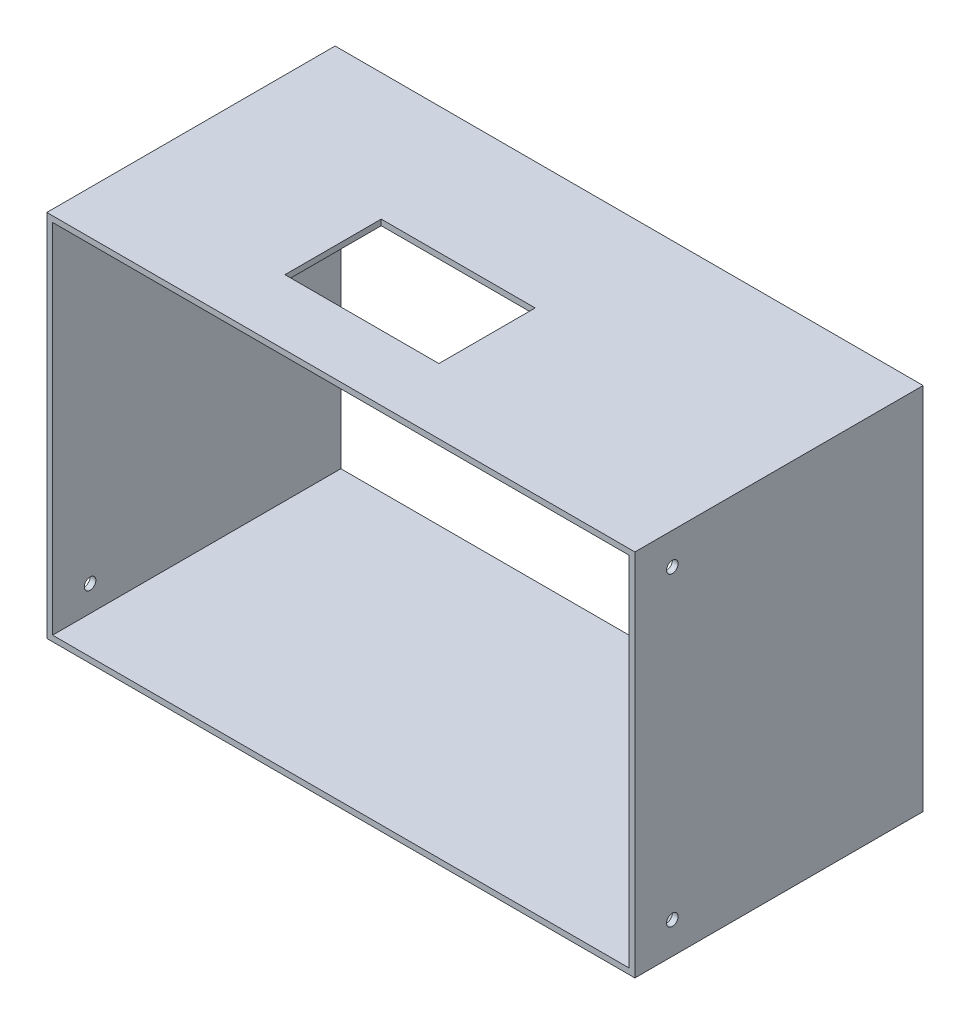
ISO-10303-21;
HEADER;
FILE_DESCRIPTION(('STEP AP214'),'2;1');
FILE_NAME('part.step','',(''),(''),'','','');
FILE_SCHEMA(('AUTOMOTIVE_DESIGN { 1 0 10303 214 1 1 1 1 }'));
ENDSEC;
DATA;
#1=APPLICATION_CONTEXT('core data for automotive mechanical design processes');
#2=APPLICATION_PROTOCOL_DEFINITION('international standard','automotive_design',2000,#1);
#3=PRODUCT_CONTEXT('',#1,'mechanical');
#4=PRODUCT('Part','Part','',(#3));
#5=PRODUCT_RELATED_PRODUCT_CATEGORY('part','',(#4));
#6=PRODUCT_DEFINITION_FORMATION('','',#4);
#7=PRODUCT_DEFINITION_CONTEXT('part definition',#1,'design');
#8=PRODUCT_DEFINITION('design','',#6,#7);
#9=PRODUCT_DEFINITION_SHAPE('','',#8);
#10=(LENGTH_UNIT() NAMED_UNIT(*) SI_UNIT(.MILLI.,.METRE.));
#11=(NAMED_UNIT(*) PLANE_ANGLE_UNIT() SI_UNIT($,.RADIAN.));
#12=(NAMED_UNIT(*) SI_UNIT($,.STERADIAN.) SOLID_ANGLE_UNIT());
#13=UNCERTAINTY_MEASURE_WITH_UNIT(LENGTH_MEASURE(1.E-05),#10,'distance_accuracy_value','');
#14=(GEOMETRIC_REPRESENTATION_CONTEXT(3) GLOBAL_UNCERTAINTY_ASSIGNED_CONTEXT((#13)) GLOBAL_UNIT_ASSIGNED_CONTEXT((#10,
#11,#12)) REPRESENTATION_CONTEXT('',''));
#15=CARTESIAN_POINT('',(0.,0.,0.));
#16=DIRECTION('',(0.,0.,1.));
#17=DIRECTION('',(1.,0.,0.));
#18=AXIS2_PLACEMENT_3D('',#15,#16,#17);
#19=CARTESIAN_POINT('',(0.,64.9999999999999,50.));
#20=DIRECTION('',(0.,1.,0.));
#21=DIRECTION('',(0.,0.,1.));
#22=AXIS2_PLACEMENT_3D('',#19,#20,#21);
#23=PLANE('',#22);
#24=DIRECTION('',(1.,0.,0.));
#25=VECTOR('',#24,1.);
#26=CARTESIAN_POINT('',(0.,64.9999999999999,0.));
#27=LINE('',#26,#25);
#28=CARTESIAN_POINT('',(3.,64.9999999999999,0.));
#29=VERTEX_POINT('',#28);
#30=CARTESIAN_POINT('',(103.,64.9999999999999,0.));
#31=VERTEX_POINT('',#30);
#32=EDGE_CURVE('E272',#29,#31,#27,.T.);
#33=ORIENTED_EDGE('',*,*,#32,.T.);
#34=DIRECTION('',(0.,0.,-1.));
#35=VECTOR('',#34,1.);
#36=CARTESIAN_POINT('',(103.,64.9999999999999,50.));
#37=LINE('',#36,#35);
#38=CARTESIAN_POINT('',(103.,64.9999999999999,50.));
#39=VERTEX_POINT('',#38);
#40=EDGE_CURVE('E278',#39,#31,#37,.T.);
#41=ORIENTED_EDGE('',*,*,#40,.F.);
#42=DIRECTION('',(1.,0.,0.));
#43=VECTOR('',#42,1.);
#44=CARTESIAN_POINT('',(0.,64.9999999999999,50.));
#45=LINE('',#44,#43);
#46=CARTESIAN_POINT('',(3.,64.9999999999999,50.));
#47=VERTEX_POINT('',#46);
#48=EDGE_CURVE('E254',#47,#39,#45,.T.);
#49=ORIENTED_EDGE('',*,*,#48,.F.);
#50=DIRECTION('',(0.,0.,-1.));
#51=VECTOR('',#50,1.);
#52=CARTESIAN_POINT('',(3.,64.9999999999999,50.));
#53=LINE('',#52,#51);
#54=EDGE_CURVE('E46',#47,#29,#53,.T.);
#55=ORIENTED_EDGE('',*,*,#54,.T.);
#56=EDGE_LOOP('',(#33,#41,#49,#55));
#57=FACE_BOUND('',#56,.T.);
#58=DIRECTION('',(1.,0.,0.));
#59=VECTOR('',#58,1.);
#60=CARTESIAN_POINT('',(0.,64.9999999999999,22.));
#61=LINE('',#60,#59);
#62=CARTESIAN_POINT('',(32.,64.9999999999999,22.));
#63=VERTEX_POINT('',#62);
#64=CARTESIAN_POINT('',(58.7,64.9999999999999,22.));
#65=VERTEX_POINT('',#64);
#66=EDGE_CURVE('E155',#63,#65,#61,.T.);
#67=ORIENTED_EDGE('',*,*,#66,.F.);
#68=DIRECTION('',(0.,0.,-1.));
#69=VECTOR('',#68,1.);
#70=CARTESIAN_POINT('',(32.,64.9999999999999,50.));
#71=LINE('',#70,#69);
#72=CARTESIAN_POINT('',(32.,64.9999999999999,38.7));
#73=VERTEX_POINT('',#72);
#74=EDGE_CURVE('E158',#73,#63,#71,.T.);
#75=ORIENTED_EDGE('',*,*,#74,.F.);
#76=DIRECTION('',(1.,0.,0.));
#77=VECTOR('',#76,1.);
#78=CARTESIAN_POINT('',(0.,64.9999999999999,38.7));
#79=LINE('',#78,#77);
#80=CARTESIAN_POINT('',(58.7,64.9999999999999,38.7));
#81=VERTEX_POINT('',#80);
#82=EDGE_CURVE('E182',#73,#81,#79,.T.);
#83=ORIENTED_EDGE('',*,*,#82,.T.);
#84=DIRECTION('',(0.,0.,-1.));
#85=VECTOR('',#84,1.);
#86=CARTESIAN_POINT('',(58.7,64.9999999999999,50.));
#87=LINE('',#86,#85);
#88=EDGE_CURVE('E185',#81,#65,#87,.T.);
#89=ORIENTED_EDGE('',*,*,#88,.T.);
#90=EDGE_LOOP('',(#67,#75,#83,#89));
#91=FACE_BOUND('',#90,.T.);
#92=ADVANCED_FACE('F37',(#57,#91),#23,.F.);
#93=CARTESIAN_POINT('',(0.,66.,50.));
#94=DIRECTION('',(0.,-1.,0.));
#95=DIRECTION('',(1.,0.,0.));
#96=AXIS2_PLACEMENT_3D('',#93,#94,#95);
#97=PLANE('',#96);
#98=DIRECTION('',(-1.,0.,0.));
#99=VECTOR('',#98,1.);
#100=CARTESIAN_POINT('',(0.,66.,0.));
#101=LINE('',#100,#99);
#102=CARTESIAN_POINT('',(104.,66.,0.));
#103=VERTEX_POINT('',#102);
#104=CARTESIAN_POINT('',(1.99999999999999,66.,0.));
#105=VERTEX_POINT('',#104);
#106=EDGE_CURVE('E261',#103,#105,#101,.T.);
#107=ORIENTED_EDGE('',*,*,#106,.T.);
#108=DIRECTION('',(0.,0.,-1.));
#109=VECTOR('',#108,1.);
#110=CARTESIAN_POINT('',(1.99999999999999,66.,50.));
#111=LINE('',#110,#109);
#112=CARTESIAN_POINT('',(1.99999999999999,66.,50.));
#113=VERTEX_POINT('',#112);
#114=EDGE_CURVE('E289',#113,#105,#111,.T.);
#115=ORIENTED_EDGE('',*,*,#114,.F.);
#116=DIRECTION('',(-1.,0.,0.));
#117=VECTOR('',#116,1.);
#118=CARTESIAN_POINT('',(0.,66.,50.));
#119=LINE('',#118,#117);
#120=CARTESIAN_POINT('',(104.,66.,50.));
#121=VERTEX_POINT('',#120);
#122=EDGE_CURVE('E242',#121,#113,#119,.T.);
#123=ORIENTED_EDGE('',*,*,#122,.F.);
#124=DIRECTION('',(0.,0.,-1.));
#125=VECTOR('',#124,1.);
#126=CARTESIAN_POINT('',(104.,66.,50.));
#127=LINE('',#126,#125);
#128=EDGE_CURVE('E279',#121,#103,#127,.T.);
#129=ORIENTED_EDGE('',*,*,#128,.T.);
#130=EDGE_LOOP('',(#107,#115,#123,#129));
#131=FACE_BOUND('',#130,.T.);
#132=DIRECTION('',(1.,0.,0.));
#133=VECTOR('',#132,1.);
#134=CARTESIAN_POINT('',(32.,66.,22.));
#135=LINE('',#134,#133);
#136=CARTESIAN_POINT('',(32.,66.,22.));
#137=VERTEX_POINT('',#136);
#138=CARTESIAN_POINT('',(58.7,66.,22.));
#139=VERTEX_POINT('',#138);
#140=EDGE_CURVE('E62',#137,#139,#135,.T.);
#141=ORIENTED_EDGE('',*,*,#140,.T.);
#142=DIRECTION('',(0.,0.,-1.));
#143=VECTOR('',#142,1.);
#144=CARTESIAN_POINT('',(58.7,66.,38.7));
#145=LINE('',#144,#143);
#146=CARTESIAN_POINT('',(58.7,66.,38.7));
#147=VERTEX_POINT('',#146);
#148=EDGE_CURVE('E162',#147,#139,#145,.T.);
#149=ORIENTED_EDGE('',*,*,#148,.F.);
#150=DIRECTION('',(1.,0.,0.));
#151=VECTOR('',#150,1.);
#152=CARTESIAN_POINT('',(32.,66.,38.7));
#153=LINE('',#152,#151);
#154=CARTESIAN_POINT('',(32.,66.,38.7));
#155=VERTEX_POINT('',#154);
#156=EDGE_CURVE('E168',#155,#147,#153,.T.);
#157=ORIENTED_EDGE('',*,*,#156,.F.);
#158=DIRECTION('',(0.,0.,-1.));
#159=VECTOR('',#158,1.);
#160=CARTESIAN_POINT('',(32.,66.,38.7));
#161=LINE('',#160,#159);
#162=EDGE_CURVE('E172',#155,#137,#161,.T.);
#163=ORIENTED_EDGE('',*,*,#162,.T.);
#164=EDGE_LOOP('',(#141,#149,#157,#163));
#165=FACE_BOUND('',#164,.T.);
#166=ADVANCED_FACE('F171',(#131,#165),#97,.F.);
#167=CARTESIAN_POINT('',(0.,2.99999999999996,50.));
#168=DIRECTION('',(0.,-1.,0.));
#169=DIRECTION('',(1.,0.,0.));
#170=AXIS2_PLACEMENT_3D('',#167,#168,#169);
#171=PLANE('',#170);
#172=DIRECTION('',(-1.,0.,0.));
#173=VECTOR('',#172,1.);
#174=CARTESIAN_POINT('',(0.,2.99999999999996,0.));
#175=LINE('',#174,#173);
#176=CARTESIAN_POINT('',(103.,2.99999999999998,0.));
#177=VERTEX_POINT('',#176);
#178=CARTESIAN_POINT('',(3.,2.99999999999996,0.));
#179=VERTEX_POINT('',#178);
#180=EDGE_CURVE('E267',#177,#179,#175,.T.);
#181=ORIENTED_EDGE('',*,*,#180,.T.);
#182=DIRECTION('',(0.,0.,-1.));
#183=VECTOR('',#182,1.);
#184=CARTESIAN_POINT('',(3.,2.99999999999996,50.));
#185=LINE('',#184,#183);
#186=CARTESIAN_POINT('',(3.,2.99999999999996,50.));
#187=VERTEX_POINT('',#186);
#188=EDGE_CURVE('E11',#187,#179,#185,.T.);
#189=ORIENTED_EDGE('',*,*,#188,.F.);
#190=DIRECTION('',(-1.,0.,0.));
#191=VECTOR('',#190,1.);
#192=CARTESIAN_POINT('',(0.,2.99999999999996,50.));
#193=LINE('',#192,#191);
#194=CARTESIAN_POINT('',(103.,2.99999999999998,50.));
#195=VERTEX_POINT('',#194);
#196=EDGE_CURVE('E249',#195,#187,#193,.T.);
#197=ORIENTED_EDGE('',*,*,#196,.F.);
#198=DIRECTION('',(0.,0.,-1.));
#199=VECTOR('',#198,1.);
#200=CARTESIAN_POINT('',(103.,2.99999999999998,50.));
#201=LINE('',#200,#199);
#202=EDGE_CURVE('E275',#195,#177,#201,.T.);
#203=ORIENTED_EDGE('',*,*,#202,.T.);
#204=EDGE_LOOP('',(#181,#189,#197,#203));
#205=FACE_BOUND('',#204,.T.);
#206=ADVANCED_FACE('F326',(#205),#171,.F.);
#207=CARTESIAN_POINT('',(3.,0.,50.));
#208=DIRECTION('',(-1.,0.,0.));
#209=DIRECTION('',(0.,-1.,0.));
#210=AXIS2_PLACEMENT_3D('',#207,#208,#209);
#211=PLANE('',#210);
#212=DIRECTION('',(0.,-1.,0.));
#213=VECTOR('',#212,1.);
#214=CARTESIAN_POINT('',(3.,0.,12.));
#215=LINE('',#214,#213);
#216=CARTESIAN_POINT('',(3.,61.,12.));
#217=VERTEX_POINT('',#216);
#218=CARTESIAN_POINT('',(3.,52.5,12.));
#219=VERTEX_POINT('',#218);
#220=EDGE_CURVE('E213',#217,#219,#215,.T.);
#221=ORIENTED_EDGE('',*,*,#220,.T.);
#222=DIRECTION('',(0.,0.,1.));
#223=VECTOR('',#222,1.);
#224=CARTESIAN_POINT('',(3.,52.5,50.));
#225=LINE('',#224,#223);
#226=CARTESIAN_POINT('',(3.,52.5,20.5));
#227=VERTEX_POINT('',#226);
#228=EDGE_CURVE('E216',#219,#227,#225,.T.);
#229=ORIENTED_EDGE('',*,*,#228,.T.);
#230=DIRECTION('',(0.,-1.,0.));
#231=VECTOR('',#230,1.);
#232=CARTESIAN_POINT('',(3.,0.,20.5));
#233=LINE('',#232,#231);
#234=CARTESIAN_POINT('',(3.,61.,20.5));
#235=VERTEX_POINT('',#234);
#236=EDGE_CURVE('E202',#235,#227,#233,.T.);
#237=ORIENTED_EDGE('',*,*,#236,.F.);
#238=DIRECTION('',(0.,0.,1.));
#239=VECTOR('',#238,1.);
#240=CARTESIAN_POINT('',(3.,61.,50.));
#241=LINE('',#240,#239);
#242=EDGE_CURVE('E210',#217,#235,#241,.T.);
#243=ORIENTED_EDGE('',*,*,#242,.F.);
#244=EDGE_LOOP('',(#221,#229,#237,#243));
#245=FACE_BOUND('',#244,.T.);
#246=CARTESIAN_POINT('',(3.,7.49999999999998,43.5));
#247=DIRECTION('',(-1.,0.,0.));
#248=DIRECTION('',(0.,-1.,0.));
#249=AXIS2_PLACEMENT_3D('',#246,#247,#248);
#250=CIRCLE('',#249,0.999999999999998);
#251=CARTESIAN_POINT('',(3.,6.49999999999998,43.5));
#252=VERTEX_POINT('',#251);
#253=EDGE_CURVE('E235',#252,#252,#250,.T.);
#254=ORIENTED_EDGE('',*,*,#253,.T.);
#255=EDGE_LOOP('',(#254));
#256=FACE_BOUND('',#255,.T.);
#257=CARTESIAN_POINT('',(3.,60.5,43.5));
#258=DIRECTION('',(-1.,0.,0.));
#259=DIRECTION('',(0.,-1.,0.));
#260=AXIS2_PLACEMENT_3D('',#257,#258,#259);
#261=CIRCLE('',#260,0.999999999999998);
#262=CARTESIAN_POINT('',(3.,59.5,43.5));
#263=VERTEX_POINT('',#262);
#264=EDGE_CURVE('E229',#263,#263,#261,.T.);
#265=ORIENTED_EDGE('',*,*,#264,.T.);
#266=EDGE_LOOP('',(#265));
#267=FACE_BOUND('',#266,.T.);
#268=DIRECTION('',(0.,1.,0.));
#269=VECTOR('',#268,1.);
#270=CARTESIAN_POINT('',(3.,0.,0.));
#271=LINE('',#270,#269);
#272=EDGE_CURVE('E270',#179,#29,#271,.T.);
#273=ORIENTED_EDGE('',*,*,#272,.T.);
#274=ORIENTED_EDGE('',*,*,#54,.F.);
#275=DIRECTION('',(0.,1.,0.));
#276=VECTOR('',#275,1.);
#277=CARTESIAN_POINT('',(3.,0.,50.));
#278=LINE('',#277,#276);
#279=EDGE_CURVE('E252',#187,#47,#278,.T.);
#280=ORIENTED_EDGE('',*,*,#279,.F.);
#281=ORIENTED_EDGE('',*,*,#188,.T.);
#282=EDGE_LOOP('',(#273,#274,#280,#281));
#283=FACE_BOUND('',#282,.T.);
#284=ADVANCED_FACE('F331',(#245,#256,#267,#283),#211,.F.);
#285=CARTESIAN_POINT('',(104.,0.,50.));
#286=DIRECTION('',(-1.,0.,0.));
#287=DIRECTION('',(0.,0.,1.));
#288=AXIS2_PLACEMENT_3D('',#285,#286,#287);
#289=PLANE('',#288);
#290=CARTESIAN_POINT('',(104.,7.49999999999998,43.5));
#291=DIRECTION('',(-1.,0.,0.));
#292=DIRECTION('',(0.,0.,1.));
#293=AXIS2_PLACEMENT_3D('',#290,#291,#292);
#294=CIRCLE('',#293,0.999999999999998);
#295=CARTESIAN_POINT('',(104.,7.49999999999998,44.5));
#296=VERTEX_POINT('',#295);
#297=EDGE_CURVE('E220',#296,#296,#294,.T.);
#298=ORIENTED_EDGE('',*,*,#297,.T.);
#299=EDGE_LOOP('',(#298));
#300=FACE_BOUND('',#299,.T.);
#301=CARTESIAN_POINT('',(104.,60.5,43.5));
#302=DIRECTION('',(-1.,0.,0.));
#303=DIRECTION('',(0.,0.,1.));
#304=AXIS2_PLACEMENT_3D('',#301,#302,#303);
#305=CIRCLE('',#304,0.999999999999998);
#306=CARTESIAN_POINT('',(104.,60.5,44.5));
#307=VERTEX_POINT('',#306);
#308=EDGE_CURVE('E219',#307,#307,#305,.T.);
#309=ORIENTED_EDGE('',*,*,#308,.T.);
#310=EDGE_LOOP('',(#309));
#311=FACE_BOUND('',#310,.T.);
#312=DIRECTION('',(0.,1.,0.));
#313=VECTOR('',#312,1.);
#314=CARTESIAN_POINT('',(104.,0.,0.));
#315=LINE('',#314,#313);
#316=CARTESIAN_POINT('',(104.,2.,0.));
#317=VERTEX_POINT('',#316);
#318=EDGE_CURVE('E238',#317,#103,#315,.T.);
#319=ORIENTED_EDGE('',*,*,#318,.T.);
#320=ORIENTED_EDGE('',*,*,#128,.F.);
#321=DIRECTION('',(0.,1.,0.));
#322=VECTOR('',#321,1.);
#323=CARTESIAN_POINT('',(104.,0.,50.));
#324=LINE('',#323,#322);
#325=CARTESIAN_POINT('',(104.,2.,50.));
#326=VERTEX_POINT('',#325);
#327=EDGE_CURVE('E239',#326,#121,#324,.T.);
#328=ORIENTED_EDGE('',*,*,#327,.F.);
#329=DIRECTION('',(0.,0.,-1.));
#330=VECTOR('',#329,1.);
#331=CARTESIAN_POINT('',(104.,2.,50.));
#332=LINE('',#331,#330);
#333=EDGE_CURVE('E258',#326,#317,#332,.T.);
#334=ORIENTED_EDGE('',*,*,#333,.T.);
#335=EDGE_LOOP('',(#319,#320,#328,#334));
#336=FACE_BOUND('',#335,.T.);
#337=ADVANCED_FACE('F39',(#300,#311,#336),#289,.F.);
#338=CARTESIAN_POINT('',(2.,0.,50.));
#339=DIRECTION('',(1.,0.,0.));
#340=DIRECTION('',(0.,1.,0.));
#341=AXIS2_PLACEMENT_3D('',#338,#339,#340);
#342=PLANE('',#341);
#343=DIRECTION('',(0.,-1.,0.));
#344=VECTOR('',#343,1.);
#345=CARTESIAN_POINT('',(1.99999999999999,61.,20.5));
#346=LINE('',#345,#344);
#347=CARTESIAN_POINT('',(1.99999999999999,61.,20.5));
#348=VERTEX_POINT('',#347);
#349=CARTESIAN_POINT('',(1.99999999999999,52.5,20.5));
#350=VERTEX_POINT('',#349);
#351=EDGE_CURVE('E190',#348,#350,#346,.T.);
#352=ORIENTED_EDGE('',*,*,#351,.T.);
#353=DIRECTION('',(0.,0.,1.));
#354=VECTOR('',#353,1.);
#355=CARTESIAN_POINT('',(1.99999999999999,52.5,12.));
#356=LINE('',#355,#354);
#357=CARTESIAN_POINT('',(1.99999999999999,52.5,12.));
#358=VERTEX_POINT('',#357);
#359=EDGE_CURVE('E188',#358,#350,#356,.T.);
#360=ORIENTED_EDGE('',*,*,#359,.F.);
#361=DIRECTION('',(0.,-1.,0.));
#362=VECTOR('',#361,1.);
#363=CARTESIAN_POINT('',(1.99999999999999,61.,12.));
#364=LINE('',#363,#362);
#365=CARTESIAN_POINT('',(1.99999999999999,61.,12.));
#366=VERTEX_POINT('',#365);
#367=EDGE_CURVE('E196',#366,#358,#364,.T.);
#368=ORIENTED_EDGE('',*,*,#367,.F.);
#369=DIRECTION('',(0.,0.,1.));
#370=VECTOR('',#369,1.);
#371=CARTESIAN_POINT('',(1.99999999999999,61.,12.));
#372=LINE('',#371,#370);
#373=EDGE_CURVE('E193',#366,#348,#372,.T.);
#374=ORIENTED_EDGE('',*,*,#373,.T.);
#375=EDGE_LOOP('',(#352,#360,#368,#374));
#376=FACE_BOUND('',#375,.T.);
#377=CARTESIAN_POINT('',(2.,7.49999999999998,43.5));
#378=DIRECTION('',(1.,0.,0.));
#379=DIRECTION('',(0.,1.,0.));
#380=AXIS2_PLACEMENT_3D('',#377,#378,#379);
#381=CIRCLE('',#380,0.999999999999998);
#382=CARTESIAN_POINT('',(2.,8.49999999999998,43.5));
#383=VERTEX_POINT('',#382);
#384=EDGE_CURVE('E232',#383,#383,#381,.T.);
#385=ORIENTED_EDGE('',*,*,#384,.T.);
#386=EDGE_LOOP('',(#385));
#387=FACE_BOUND('',#386,.T.);
#388=CARTESIAN_POINT('',(1.99999999999999,60.5,43.5));
#389=DIRECTION('',(1.,0.,0.));
#390=DIRECTION('',(0.,1.,0.));
#391=AXIS2_PLACEMENT_3D('',#388,#389,#390);
#392=CIRCLE('',#391,0.999999999999998);
#393=CARTESIAN_POINT('',(1.99999999999999,61.5,43.5));
#394=VERTEX_POINT('',#393);
#395=EDGE_CURVE('E226',#394,#394,#392,.T.);
#396=ORIENTED_EDGE('',*,*,#395,.T.);
#397=EDGE_LOOP('',(#396));
#398=FACE_BOUND('',#397,.T.);
#399=DIRECTION('',(0.,-1.,0.));
#400=VECTOR('',#399,1.);
#401=CARTESIAN_POINT('',(2.,0.,0.));
#402=LINE('',#401,#400);
#403=CARTESIAN_POINT('',(2.,2.,0.));
#404=VERTEX_POINT('',#403);
#405=EDGE_CURVE('E263',#105,#404,#402,.T.);
#406=ORIENTED_EDGE('',*,*,#405,.T.);
#407=DIRECTION('',(0.,0.,-1.));
#408=VECTOR('',#407,1.);
#409=CARTESIAN_POINT('',(2.,2.,50.));
#410=LINE('',#409,#408);
#411=CARTESIAN_POINT('',(2.,2.,50.));
#412=VERTEX_POINT('',#411);
#413=EDGE_CURVE('E286',#412,#404,#410,.T.);
#414=ORIENTED_EDGE('',*,*,#413,.F.);
#415=DIRECTION('',(0.,-1.,0.));
#416=VECTOR('',#415,1.);
#417=CARTESIAN_POINT('',(2.,0.,50.));
#418=LINE('',#417,#416);
#419=EDGE_CURVE('E245',#113,#412,#418,.T.);
#420=ORIENTED_EDGE('',*,*,#419,.F.);
#421=ORIENTED_EDGE('',*,*,#114,.T.);
#422=EDGE_LOOP('',(#406,#414,#420,#421));
#423=FACE_BOUND('',#422,.T.);
#424=ADVANCED_FACE('F341',(#376,#387,#398,#423),#342,.F.);
#425=CARTESIAN_POINT('',(0.,2.,50.));
#426=DIRECTION('',(0.,1.,0.));
#427=DIRECTION('',(0.,0.,1.));
#428=AXIS2_PLACEMENT_3D('',#425,#426,#427);
#429=PLANE('',#428);
#430=DIRECTION('',(1.,0.,0.));
#431=VECTOR('',#430,1.);
#432=CARTESIAN_POINT('',(0.,2.,0.));
#433=LINE('',#432,#431);
#434=EDGE_CURVE('E265',#404,#317,#433,.T.);
#435=ORIENTED_EDGE('',*,*,#434,.T.);
#436=ORIENTED_EDGE('',*,*,#333,.F.);
#437=DIRECTION('',(1.,0.,0.));
#438=VECTOR('',#437,1.);
#439=CARTESIAN_POINT('',(0.,2.,50.));
#440=LINE('',#439,#438);
#441=EDGE_CURVE('E247',#412,#326,#440,.T.);
#442=ORIENTED_EDGE('',*,*,#441,.F.);
#443=ORIENTED_EDGE('',*,*,#413,.T.);
#444=EDGE_LOOP('',(#435,#436,#442,#443));
#445=FACE_BOUND('',#444,.T.);
#446=ADVANCED_FACE('F338',(#445),#429,.F.);
#447=CARTESIAN_POINT('',(103.,0.,50.));
#448=DIRECTION('',(1.,0.,0.));
#449=DIRECTION('',(0.,0.,-1.));
#450=AXIS2_PLACEMENT_3D('',#447,#448,#449);
#451=PLANE('',#450);
#452=CARTESIAN_POINT('',(103.,7.49999999999998,43.5));
#453=DIRECTION('',(1.,0.,0.));
#454=DIRECTION('',(0.,0.,-1.));
#455=AXIS2_PLACEMENT_3D('',#452,#453,#454);
#456=CIRCLE('',#455,0.999999999999998);
#457=CARTESIAN_POINT('',(103.,7.49999999999998,42.5));
#458=VERTEX_POINT('',#457);
#459=EDGE_CURVE('E41',#458,#458,#456,.T.);
#460=ORIENTED_EDGE('',*,*,#459,.T.);
#461=EDGE_LOOP('',(#460));
#462=FACE_BOUND('',#461,.T.);
#463=CARTESIAN_POINT('',(103.,60.5,43.5));
#464=DIRECTION('',(1.,0.,0.));
#465=DIRECTION('',(0.,0.,-1.));
#466=AXIS2_PLACEMENT_3D('',#463,#464,#465);
#467=CIRCLE('',#466,0.999999999999998);
#468=CARTESIAN_POINT('',(103.,60.5,42.5));
#469=VERTEX_POINT('',#468);
#470=EDGE_CURVE('E223',#469,#469,#467,.T.);
#471=ORIENTED_EDGE('',*,*,#470,.T.);
#472=EDGE_LOOP('',(#471));
#473=FACE_BOUND('',#472,.T.);
#474=DIRECTION('',(0.,-1.,0.));
#475=VECTOR('',#474,1.);
#476=CARTESIAN_POINT('',(103.,0.,0.));
#477=LINE('',#476,#475);
#478=EDGE_CURVE('E243',#31,#177,#477,.T.);
#479=ORIENTED_EDGE('',*,*,#478,.T.);
#480=ORIENTED_EDGE('',*,*,#202,.F.);
#481=DIRECTION('',(0.,-1.,0.));
#482=VECTOR('',#481,1.);
#483=CARTESIAN_POINT('',(103.,0.,50.));
#484=LINE('',#483,#482);
#485=EDGE_CURVE('E256',#39,#195,#484,.T.);
#486=ORIENTED_EDGE('',*,*,#485,.F.);
#487=ORIENTED_EDGE('',*,*,#40,.T.);
#488=EDGE_LOOP('',(#479,#480,#486,#487));
#489=FACE_BOUND('',#488,.T.);
#490=ADVANCED_FACE('F296',(#462,#473,#489),#451,.F.);
#491=CARTESIAN_POINT('',(0.,0.,50.));
#492=DIRECTION('',(0.,0.,1.));
#493=DIRECTION('',(1.,0.,0.));
#494=AXIS2_PLACEMENT_3D('',#491,#492,#493);
#495=PLANE('',#494);
#496=ORIENTED_EDGE('',*,*,#327,.T.);
#497=ORIENTED_EDGE('',*,*,#122,.T.);
#498=ORIENTED_EDGE('',*,*,#419,.T.);
#499=ORIENTED_EDGE('',*,*,#441,.T.);
#500=EDGE_LOOP('',(#496,#497,#498,#499));
#501=FACE_BOUND('',#500,.T.);
#502=ORIENTED_EDGE('',*,*,#196,.T.);
#503=ORIENTED_EDGE('',*,*,#279,.T.);
#504=ORIENTED_EDGE('',*,*,#48,.T.);
#505=ORIENTED_EDGE('',*,*,#485,.T.);
#506=EDGE_LOOP('',(#502,#503,#504,#505));
#507=FACE_BOUND('',#506,.T.);
#508=ADVANCED_FACE('F313',(#501,#507),#495,.T.);
#509=CARTESIAN_POINT('',(0.,0.,0.));
#510=DIRECTION('',(0.,0.,1.));
#511=DIRECTION('',(1.,0.,0.));
#512=AXIS2_PLACEMENT_3D('',#509,#510,#511);
#513=PLANE('',#512);
#514=ORIENTED_EDGE('',*,*,#318,.F.);
#515=ORIENTED_EDGE('',*,*,#434,.F.);
#516=ORIENTED_EDGE('',*,*,#405,.F.);
#517=ORIENTED_EDGE('',*,*,#106,.F.);
#518=EDGE_LOOP('',(#514,#515,#516,#517));
#519=FACE_BOUND('',#518,.T.);
#520=ORIENTED_EDGE('',*,*,#180,.F.);
#521=ORIENTED_EDGE('',*,*,#478,.F.);
#522=ORIENTED_EDGE('',*,*,#32,.F.);
#523=ORIENTED_EDGE('',*,*,#272,.F.);
#524=EDGE_LOOP('',(#520,#521,#522,#523));
#525=FACE_BOUND('',#524,.T.);
#526=ADVANCED_FACE('F302',(#519,#525),#513,.F.);
#527=CARTESIAN_POINT('',(104.,60.5,43.5));
#528=DIRECTION('',(-1.,0.,0.));
#529=DIRECTION('',(0.,0.,1.));
#530=AXIS2_PLACEMENT_3D('',#527,#528,#529);
#531=CYLINDRICAL_SURFACE('',#530,0.999999999999998);
#532=ORIENTED_EDGE('',*,*,#308,.F.);
#533=EDGE_LOOP('',(#532));
#534=FACE_BOUND('',#533,.T.);
#535=ORIENTED_EDGE('',*,*,#470,.F.);
#536=EDGE_LOOP('',(#535));
#537=FACE_BOUND('',#536,.T.);
#538=ADVANCED_FACE('F299',(#534,#537),#531,.F.);
#539=CARTESIAN_POINT('',(104.,7.49999999999998,43.5));
#540=DIRECTION('',(-1.,0.,0.));
#541=DIRECTION('',(0.,0.,1.));
#542=AXIS2_PLACEMENT_3D('',#539,#540,#541);
#543=CYLINDRICAL_SURFACE('',#542,0.999999999999998);
#544=ORIENTED_EDGE('',*,*,#297,.F.);
#545=EDGE_LOOP('',(#544));
#546=FACE_BOUND('',#545,.T.);
#547=ORIENTED_EDGE('',*,*,#459,.F.);
#548=EDGE_LOOP('',(#547));
#549=FACE_BOUND('',#548,.T.);
#550=ADVANCED_FACE('F301',(#546,#549),#543,.F.);
#551=ORIENTED_EDGE('',*,*,#395,.F.);
#552=EDGE_LOOP('',(#551));
#553=FACE_BOUND('',#552,.T.);
#554=ORIENTED_EDGE('',*,*,#264,.F.);
#555=EDGE_LOOP('',(#554));
#556=FACE_BOUND('',#555,.T.);
#557=ADVANCED_FACE('F305',(#553,#556),#531,.F.);
#558=ORIENTED_EDGE('',*,*,#384,.F.);
#559=EDGE_LOOP('',(#558));
#560=FACE_BOUND('',#559,.T.);
#561=ORIENTED_EDGE('',*,*,#253,.F.);
#562=EDGE_LOOP('',(#561));
#563=FACE_BOUND('',#562,.T.);
#564=ADVANCED_FACE('F312',(#560,#563),#543,.F.);
#565=CARTESIAN_POINT('',(12.,52.5,12.));
#566=DIRECTION('',(0.,-1.,0.));
#567=DIRECTION('',(1.,0.,0.));
#568=AXIS2_PLACEMENT_3D('',#565,#566,#567);
#569=PLANE('',#568);
#570=DIRECTION('',(-1.,0.,0.));
#571=VECTOR('',#570,1.);
#572=CARTESIAN_POINT('',(12.,52.5,12.));
#573=LINE('',#572,#571);
#574=EDGE_CURVE('E200',#219,#358,#573,.T.);
#575=ORIENTED_EDGE('',*,*,#574,.T.);
#576=ORIENTED_EDGE('',*,*,#359,.T.);
#577=DIRECTION('',(-1.,0.,0.));
#578=VECTOR('',#577,1.);
#579=CARTESIAN_POINT('',(12.,52.5,20.5));
#580=LINE('',#579,#578);
#581=EDGE_CURVE('E199',#227,#350,#580,.T.);
#582=ORIENTED_EDGE('',*,*,#581,.F.);
#583=ORIENTED_EDGE('',*,*,#228,.F.);
#584=EDGE_LOOP('',(#575,#576,#582,#583));
#585=FACE_BOUND('',#584,.T.);
#586=ADVANCED_FACE('F473',(#585),#569,.F.);
#587=CARTESIAN_POINT('',(12.,61.,12.));
#588=DIRECTION('',(0.,0.,-1.));
#589=DIRECTION('',(0.,1.,0.));
#590=AXIS2_PLACEMENT_3D('',#587,#588,#589);
#591=PLANE('',#590);
#592=DIRECTION('',(-1.,0.,0.));
#593=VECTOR('',#592,1.);
#594=CARTESIAN_POINT('',(12.,61.,12.));
#595=LINE('',#594,#593);
#596=EDGE_CURVE('E203',#217,#366,#595,.T.);
#597=ORIENTED_EDGE('',*,*,#596,.T.);
#598=ORIENTED_EDGE('',*,*,#367,.T.);
#599=ORIENTED_EDGE('',*,*,#574,.F.);
#600=ORIENTED_EDGE('',*,*,#220,.F.);
#601=EDGE_LOOP('',(#597,#598,#599,#600));
#602=FACE_BOUND('',#601,.T.);
#603=ADVANCED_FACE('F469',(#602),#591,.F.);
#604=CARTESIAN_POINT('',(12.,61.,12.));
#605=DIRECTION('',(0.,-1.,0.));
#606=DIRECTION('',(1.,0.,0.));
#607=AXIS2_PLACEMENT_3D('',#604,#605,#606);
#608=PLANE('',#607);
#609=ORIENTED_EDGE('',*,*,#242,.T.);
#610=DIRECTION('',(-1.,0.,0.));
#611=VECTOR('',#610,1.);
#612=CARTESIAN_POINT('',(12.,61.,20.5));
#613=LINE('',#612,#611);
#614=EDGE_CURVE('E205',#235,#348,#613,.T.);
#615=ORIENTED_EDGE('',*,*,#614,.T.);
#616=ORIENTED_EDGE('',*,*,#373,.F.);
#617=ORIENTED_EDGE('',*,*,#596,.F.);
#618=EDGE_LOOP('',(#609,#615,#616,#617));
#619=FACE_BOUND('',#618,.T.);
#620=ADVANCED_FACE('F472',(#619),#608,.T.);
#621=CARTESIAN_POINT('',(12.,61.,20.5));
#622=DIRECTION('',(0.,0.,-1.));
#623=DIRECTION('',(0.,1.,0.));
#624=AXIS2_PLACEMENT_3D('',#621,#622,#623);
#625=PLANE('',#624);
#626=ORIENTED_EDGE('',*,*,#236,.T.);
#627=ORIENTED_EDGE('',*,*,#581,.T.);
#628=ORIENTED_EDGE('',*,*,#351,.F.);
#629=ORIENTED_EDGE('',*,*,#614,.F.);
#630=EDGE_LOOP('',(#626,#627,#628,#629));
#631=FACE_BOUND('',#630,.T.);
#632=ADVANCED_FACE('F436',(#631),#625,.T.);
#633=CARTESIAN_POINT('',(32.,56.,22.));
#634=DIRECTION('',(0.,0.,1.));
#635=DIRECTION('',(1.,0.,0.));
#636=AXIS2_PLACEMENT_3D('',#633,#634,#635);
#637=PLANE('',#636);
#638=ORIENTED_EDGE('',*,*,#66,.T.);
#639=DIRECTION('',(0.,1.,0.));
#640=VECTOR('',#639,1.);
#641=CARTESIAN_POINT('',(58.7,56.,22.));
#642=LINE('',#641,#640);
#643=EDGE_CURVE('E151',#65,#139,#642,.T.);
#644=ORIENTED_EDGE('',*,*,#643,.T.);
#645=ORIENTED_EDGE('',*,*,#140,.F.);
#646=DIRECTION('',(0.,1.,0.));
#647=VECTOR('',#646,1.);
#648=CARTESIAN_POINT('',(32.,56.,22.));
#649=LINE('',#648,#647);
#650=EDGE_CURVE('E177',#63,#137,#649,.T.);
#651=ORIENTED_EDGE('',*,*,#650,.F.);
#652=EDGE_LOOP('',(#638,#644,#645,#651));
#653=FACE_BOUND('',#652,.T.);
#654=ADVANCED_FACE('F153',(#653),#637,.T.);
#655=CARTESIAN_POINT('',(58.7,56.,38.7));
#656=DIRECTION('',(1.,0.,0.));
#657=DIRECTION('',(0.,1.,0.));
#658=AXIS2_PLACEMENT_3D('',#655,#656,#657);
#659=PLANE('',#658);
#660=DIRECTION('',(0.,1.,0.));
#661=VECTOR('',#660,1.);
#662=CARTESIAN_POINT('',(58.7,56.,38.7));
#663=LINE('',#662,#661);
#664=EDGE_CURVE('E159',#81,#147,#663,.T.);
#665=ORIENTED_EDGE('',*,*,#664,.T.);
#666=ORIENTED_EDGE('',*,*,#148,.T.);
#667=ORIENTED_EDGE('',*,*,#643,.F.);
#668=ORIENTED_EDGE('',*,*,#88,.F.);
#669=EDGE_LOOP('',(#665,#666,#667,#668));
#670=FACE_BOUND('',#669,.T.);
#671=ADVANCED_FACE('F163',(#670),#659,.F.);
#672=CARTESIAN_POINT('',(32.,56.,38.7));
#673=DIRECTION('',(0.,0.,1.));
#674=DIRECTION('',(1.,0.,0.));
#675=AXIS2_PLACEMENT_3D('',#672,#673,#674);
#676=PLANE('',#675);
#677=DIRECTION('',(0.,1.,0.));
#678=VECTOR('',#677,1.);
#679=CARTESIAN_POINT('',(32.,56.,38.7));
#680=LINE('',#679,#678);
#681=EDGE_CURVE('E54',#73,#155,#680,.T.);
#682=ORIENTED_EDGE('',*,*,#681,.T.);
#683=ORIENTED_EDGE('',*,*,#156,.T.);
#684=ORIENTED_EDGE('',*,*,#664,.F.);
#685=ORIENTED_EDGE('',*,*,#82,.F.);
#686=EDGE_LOOP('',(#682,#683,#684,#685));
#687=FACE_BOUND('',#686,.T.);
#688=ADVANCED_FACE('F446',(#687),#676,.F.);
#689=CARTESIAN_POINT('',(32.,56.,38.7));
#690=DIRECTION('',(1.,0.,0.));
#691=DIRECTION('',(0.,1.,0.));
#692=AXIS2_PLACEMENT_3D('',#689,#690,#691);
#693=PLANE('',#692);
#694=ORIENTED_EDGE('',*,*,#74,.T.);
#695=ORIENTED_EDGE('',*,*,#650,.T.);
#696=ORIENTED_EDGE('',*,*,#162,.F.);
#697=ORIENTED_EDGE('',*,*,#681,.F.);
#698=EDGE_LOOP('',(#694,#695,#696,#697));
#699=FACE_BOUND('',#698,.T.);
#700=ADVANCED_FACE('F455',(#699),#693,.T.);
#701=CLOSED_SHELL('',(#92,#166,#206,#284,#337,#424,#446,#490,#508,#526,#538,#550,#557,#564,#586,
#603,#620,#632,#654,#671,#688,#700));
#702=MANIFOLD_SOLID_BREP('B2',#701);
#703=ADVANCED_BREP_SHAPE_REPRESENTATION('',(#18,#702),#14);
#704=SHAPE_DEFINITION_REPRESENTATION(#9,#703);
ENDSEC;
END-ISO-10303-21;
